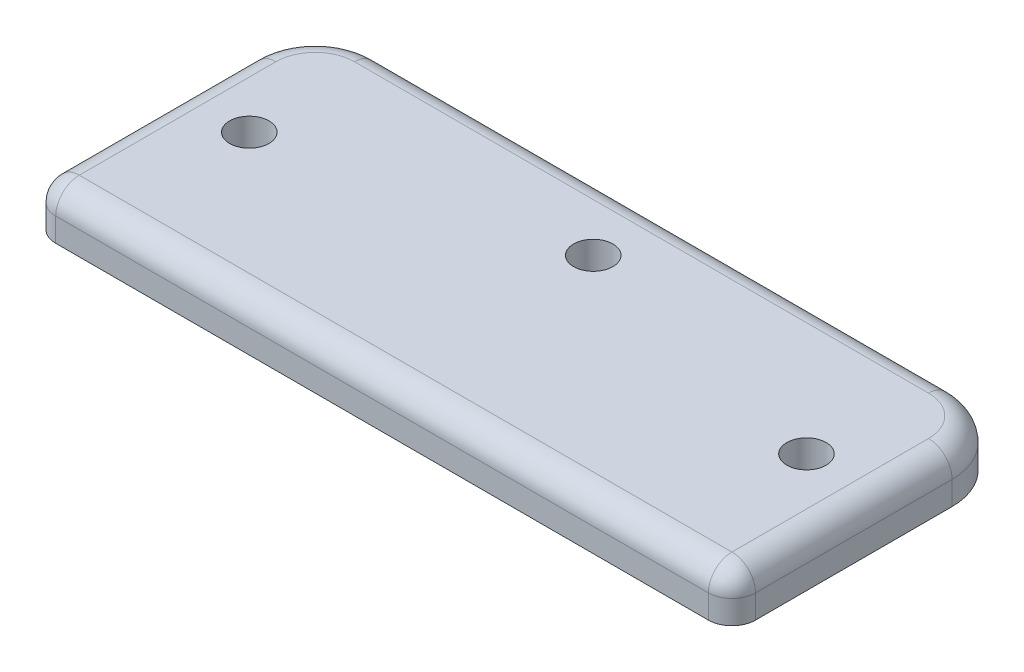
ISO-10303-21;
HEADER;
FILE_DESCRIPTION(('STEP AP214'),'2;1');
FILE_NAME('part.step','',(''),(''),'','','');
FILE_SCHEMA(('AUTOMOTIVE_DESIGN { 1 0 10303 214 1 1 1 1 }'));
ENDSEC;
DATA;
#1=APPLICATION_CONTEXT('core data for automotive mechanical design processes');
#2=APPLICATION_PROTOCOL_DEFINITION('international standard','automotive_design',2000,#1);
#3=PRODUCT_CONTEXT('',#1,'mechanical');
#4=PRODUCT('Part','Part','',(#3));
#5=PRODUCT_RELATED_PRODUCT_CATEGORY('part','',(#4));
#6=PRODUCT_DEFINITION_FORMATION('','',#4);
#7=PRODUCT_DEFINITION_CONTEXT('part definition',#1,'design');
#8=PRODUCT_DEFINITION('design','',#6,#7);
#9=PRODUCT_DEFINITION_SHAPE('','',#8);
#10=(LENGTH_UNIT() NAMED_UNIT(*) SI_UNIT(.MILLI.,.METRE.));
#11=(NAMED_UNIT(*) PLANE_ANGLE_UNIT() SI_UNIT($,.RADIAN.));
#12=(NAMED_UNIT(*) SI_UNIT($,.STERADIAN.) SOLID_ANGLE_UNIT());
#13=UNCERTAINTY_MEASURE_WITH_UNIT(LENGTH_MEASURE(1.E-05),#10,'distance_accuracy_value','');
#14=(GEOMETRIC_REPRESENTATION_CONTEXT(3) GLOBAL_UNCERTAINTY_ASSIGNED_CONTEXT((#13)) GLOBAL_UNIT_ASSIGNED_CONTEXT((#10,
#11,#12)) REPRESENTATION_CONTEXT('',''));
#15=CARTESIAN_POINT('',(0.,0.,0.));
#16=DIRECTION('',(0.,0.,1.));
#17=DIRECTION('',(1.,0.,0.));
#18=AXIS2_PLACEMENT_3D('',#15,#16,#17);
#19=CARTESIAN_POINT('',(36.5,6.,-10.));
#20=DIRECTION('',(0.,1.,0.));
#21=DIRECTION('',(0.,0.,1.));
#22=AXIS2_PLACEMENT_3D('',#19,#20,#21);
#23=PLANE('',#22);
#24=DIRECTION('',(0.,0.,-1.));
#25=VECTOR('',#24,1.);
#26=CARTESIAN_POINT('',(41.5,6.,-9.99999999999994));
#27=LINE('',#26,#25);
#28=CARTESIAN_POINT('',(41.5,6.,15.));
#29=VERTEX_POINT('',#28);
#30=CARTESIAN_POINT('',(41.5,6.,-9.99999999999996));
#31=VERTEX_POINT('',#30);
#32=EDGE_CURVE('E185',#29,#31,#27,.T.);
#33=ORIENTED_EDGE('',*,*,#32,.T.);
#34=CARTESIAN_POINT('',(36.5,6.,-10.));
#35=DIRECTION('',(0.,1.,0.));
#36=DIRECTION('',(0.,0.,1.));
#37=AXIS2_PLACEMENT_3D('',#34,#35,#36);
#38=CIRCLE('',#37,5.);
#39=CARTESIAN_POINT('',(36.5,6.,-15.));
#40=VERTEX_POINT('',#39);
#41=EDGE_CURVE('E187',#31,#40,#38,.T.);
#42=ORIENTED_EDGE('',*,*,#41,.T.);
#43=DIRECTION('',(-1.,0.,0.));
#44=VECTOR('',#43,1.);
#45=CARTESIAN_POINT('',(-36.5,6.,-15.));
#46=LINE('',#45,#44);
#47=CARTESIAN_POINT('',(-36.5,6.,-15.));
#48=VERTEX_POINT('',#47);
#49=EDGE_CURVE('E127',#40,#48,#46,.T.);
#50=ORIENTED_EDGE('',*,*,#49,.T.);
#51=CARTESIAN_POINT('',(-36.5,6.,-10.));
#52=DIRECTION('',(0.,1.,0.));
#53=DIRECTION('',(0.,0.,1.));
#54=AXIS2_PLACEMENT_3D('',#51,#52,#53);
#55=CIRCLE('',#54,5.);
#56=CARTESIAN_POINT('',(-41.5,6.,-9.99999999999994));
#57=VERTEX_POINT('',#56);
#58=EDGE_CURVE('E179',#48,#57,#55,.T.);
#59=ORIENTED_EDGE('',*,*,#58,.T.);
#60=DIRECTION('',(0.,0.,1.));
#61=VECTOR('',#60,1.);
#62=CARTESIAN_POINT('',(-41.5,6.,15.));
#63=LINE('',#62,#61);
#64=CARTESIAN_POINT('',(-41.5,6.,15.));
#65=VERTEX_POINT('',#64);
#66=EDGE_CURVE('E181',#57,#65,#63,.T.);
#67=ORIENTED_EDGE('',*,*,#66,.T.);
#68=DIRECTION('',(1.,0.,0.));
#69=VECTOR('',#68,1.);
#70=CARTESIAN_POINT('',(41.5,6.,15.));
#71=LINE('',#70,#69);
#72=EDGE_CURVE('E183',#65,#29,#71,.T.);
#73=ORIENTED_EDGE('',*,*,#72,.T.);
#74=EDGE_LOOP('',(#33,#42,#50,#59,#67,#73));
#75=FACE_BOUND('',#74,.T.);
#76=CARTESIAN_POINT('',(35.43,6.,-0.549999999999998));
#77=DIRECTION('',(0.,1.,0.));
#78=DIRECTION('',(0.,0.,1.));
#79=AXIS2_PLACEMENT_3D('',#76,#77,#78);
#80=CIRCLE('',#79,2.5);
#81=CARTESIAN_POINT('',(35.43,6.,1.95));
#82=VERTEX_POINT('',#81);
#83=EDGE_CURVE('E237',#82,#82,#80,.T.);
#84=ORIENTED_EDGE('',*,*,#83,.F.);
#85=EDGE_LOOP('',(#84));
#86=FACE_BOUND('',#85,.T.);
#87=CARTESIAN_POINT('',(0.,6.,-8.86));
#88=DIRECTION('',(0.,1.,0.));
#89=DIRECTION('',(0.,0.,1.));
#90=AXIS2_PLACEMENT_3D('',#87,#88,#89);
#91=CIRCLE('',#90,2.5);
#92=CARTESIAN_POINT('',(0.,6.,-6.36));
#93=VERTEX_POINT('',#92);
#94=EDGE_CURVE('E144',#93,#93,#91,.T.);
#95=ORIENTED_EDGE('',*,*,#94,.F.);
#96=EDGE_LOOP('',(#95));
#97=FACE_BOUND('',#96,.T.);
#98=CARTESIAN_POINT('',(-35.43,6.,-0.549999999999998));
#99=DIRECTION('',(0.,1.,0.));
#100=DIRECTION('',(0.,0.,-1.));
#101=AXIS2_PLACEMENT_3D('',#98,#99,#100);
#102=CIRCLE('',#101,2.5);
#103=CARTESIAN_POINT('',(-35.43,6.,-3.04999999999999));
#104=VERTEX_POINT('',#103);
#105=EDGE_CURVE('E229',#104,#104,#102,.T.);
#106=ORIENTED_EDGE('',*,*,#105,.F.);
#107=EDGE_LOOP('',(#106));
#108=FACE_BOUND('',#107,.T.);
#109=ADVANCED_FACE('F33',(#75,#86,#97,#108),#23,.T.);
#110=CARTESIAN_POINT('',(36.5,0.,-10.));
#111=DIRECTION('',(0.,1.,0.));
#112=DIRECTION('',(0.,0.,1.));
#113=AXIS2_PLACEMENT_3D('',#110,#111,#112);
#114=PLANE('',#113);
#115=CARTESIAN_POINT('',(36.5,0.,-10.));
#116=DIRECTION('',(0.,1.,0.));
#117=DIRECTION('',(0.,0.,1.));
#118=AXIS2_PLACEMENT_3D('',#115,#116,#117);
#119=CIRCLE('',#118,8.);
#120=CARTESIAN_POINT('',(44.5,0.,-9.99999999999994));
#121=VERTEX_POINT('',#120);
#122=CARTESIAN_POINT('',(36.4999999999999,0.,-18.));
#123=VERTEX_POINT('',#122);
#124=EDGE_CURVE('E135',#121,#123,#119,.T.);
#125=ORIENTED_EDGE('',*,*,#124,.F.);
#126=DIRECTION('',(0.,0.,-1.));
#127=VECTOR('',#126,1.);
#128=CARTESIAN_POINT('',(44.5,0.,-9.99999999999994));
#129=LINE('',#128,#127);
#130=CARTESIAN_POINT('',(44.5,0.,15.));
#131=VERTEX_POINT('',#130);
#132=EDGE_CURVE('E164',#131,#121,#129,.T.);
#133=ORIENTED_EDGE('',*,*,#132,.F.);
#134=CARTESIAN_POINT('',(41.5,0.,15.));
#135=DIRECTION('',(0.,1.,0.));
#136=DIRECTION('',(0.,0.,1.));
#137=AXIS2_PLACEMENT_3D('',#134,#135,#136);
#138=CIRCLE('',#137,3.);
#139=CARTESIAN_POINT('',(41.5,0.,18.));
#140=VERTEX_POINT('',#139);
#141=EDGE_CURVE('E161',#140,#131,#138,.T.);
#142=ORIENTED_EDGE('',*,*,#141,.F.);
#143=DIRECTION('',(1.,0.,0.));
#144=VECTOR('',#143,1.);
#145=CARTESIAN_POINT('',(-41.5,0.,18.));
#146=LINE('',#145,#144);
#147=CARTESIAN_POINT('',(-41.5,0.,18.));
#148=VERTEX_POINT('',#147);
#149=EDGE_CURVE('E158',#148,#140,#146,.T.);
#150=ORIENTED_EDGE('',*,*,#149,.F.);
#151=CARTESIAN_POINT('',(-41.5,0.,15.));
#152=DIRECTION('',(0.,1.,0.));
#153=DIRECTION('',(0.,0.,-1.));
#154=AXIS2_PLACEMENT_3D('',#151,#152,#153);
#155=CIRCLE('',#154,3.);
#156=CARTESIAN_POINT('',(-44.5,0.,15.));
#157=VERTEX_POINT('',#156);
#158=EDGE_CURVE('E155',#157,#148,#155,.T.);
#159=ORIENTED_EDGE('',*,*,#158,.F.);
#160=DIRECTION('',(0.,0.,1.));
#161=VECTOR('',#160,1.);
#162=CARTESIAN_POINT('',(-44.5,0.,-9.99999999999994));
#163=LINE('',#162,#161);
#164=CARTESIAN_POINT('',(-44.5,0.,-9.99999999999994));
#165=VERTEX_POINT('',#164);
#166=EDGE_CURVE('E152',#165,#157,#163,.T.);
#167=ORIENTED_EDGE('',*,*,#166,.F.);
#168=CARTESIAN_POINT('',(-36.5,0.,-10.));
#169=DIRECTION('',(0.,1.,0.));
#170=DIRECTION('',(0.,0.,1.));
#171=AXIS2_PLACEMENT_3D('',#168,#169,#170);
#172=CIRCLE('',#171,8.);
#173=CARTESIAN_POINT('',(-36.5,0.,-18.));
#174=VERTEX_POINT('',#173);
#175=EDGE_CURVE('E138',#174,#165,#172,.T.);
#176=ORIENTED_EDGE('',*,*,#175,.F.);
#177=DIRECTION('',(-1.,0.,0.));
#178=VECTOR('',#177,1.);
#179=CARTESIAN_POINT('',(-36.5,0.,-18.));
#180=LINE('',#179,#178);
#181=EDGE_CURVE('E120',#123,#174,#180,.T.);
#182=ORIENTED_EDGE('',*,*,#181,.F.);
#183=EDGE_LOOP('',(#125,#133,#142,#150,#159,#167,#176,#182));
#184=FACE_BOUND('',#183,.T.);
#185=CARTESIAN_POINT('',(0.,0.,-8.86));
#186=DIRECTION('',(0.,1.,0.));
#187=DIRECTION('',(0.,0.,1.));
#188=AXIS2_PLACEMENT_3D('',#185,#186,#187);
#189=CIRCLE('',#188,2.5);
#190=CARTESIAN_POINT('',(0.,0.,-6.36));
#191=VERTEX_POINT('',#190);
#192=EDGE_CURVE('E147',#191,#191,#189,.T.);
#193=ORIENTED_EDGE('',*,*,#192,.T.);
#194=EDGE_LOOP('',(#193));
#195=FACE_BOUND('',#194,.T.);
#196=CARTESIAN_POINT('',(35.43,0.,-0.549999999999998));
#197=DIRECTION('',(0.,1.,0.));
#198=DIRECTION('',(0.,0.,1.));
#199=AXIS2_PLACEMENT_3D('',#196,#197,#198);
#200=CIRCLE('',#199,2.5);
#201=CARTESIAN_POINT('',(35.43,0.,1.95));
#202=VERTEX_POINT('',#201);
#203=EDGE_CURVE('E234',#202,#202,#200,.T.);
#204=ORIENTED_EDGE('',*,*,#203,.T.);
#205=EDGE_LOOP('',(#204));
#206=FACE_BOUND('',#205,.T.);
#207=CARTESIAN_POINT('',(-35.43,0.,-0.549999999999998));
#208=DIRECTION('',(0.,1.,0.));
#209=DIRECTION('',(0.,0.,-1.));
#210=AXIS2_PLACEMENT_3D('',#207,#208,#209);
#211=CIRCLE('',#210,2.5);
#212=CARTESIAN_POINT('',(-35.43,0.,-3.04999999999999));
#213=VERTEX_POINT('',#212);
#214=EDGE_CURVE('E224',#213,#213,#211,.T.);
#215=ORIENTED_EDGE('',*,*,#214,.T.);
#216=EDGE_LOOP('',(#215));
#217=FACE_BOUND('',#216,.T.);
#218=ADVANCED_FACE('F132',(#184,#195,#206,#217),#114,.F.);
#219=CARTESIAN_POINT('',(36.5,6.,-10.));
#220=DIRECTION('',(0.,-1.,0.));
#221=DIRECTION('',(0.,0.,-1.));
#222=AXIS2_PLACEMENT_3D('',#219,#220,#221);
#223=CYLINDRICAL_SURFACE('',#222,8.);
#224=DIRECTION('',(0.,-1.,0.));
#225=VECTOR('',#224,1.);
#226=CARTESIAN_POINT('',(36.4999999999999,6.,-18.));
#227=LINE('',#226,#225);
#228=CARTESIAN_POINT('',(36.4999999999999,3.,-18.));
#229=VERTEX_POINT('',#228);
#230=EDGE_CURVE('E117',#229,#123,#227,.T.);
#231=ORIENTED_EDGE('',*,*,#230,.F.);
#232=CARTESIAN_POINT('',(36.5,3.,-10.));
#233=DIRECTION('',(0.,1.,0.));
#234=DIRECTION('',(0.,0.,1.));
#235=AXIS2_PLACEMENT_3D('',#232,#233,#234);
#236=CIRCLE('',#235,8.);
#237=CARTESIAN_POINT('',(44.5,3.,-9.99999999999994));
#238=VERTEX_POINT('',#237);
#239=EDGE_CURVE('E190',#229,#238,#236,.F.);
#240=ORIENTED_EDGE('',*,*,#239,.T.);
#241=DIRECTION('',(0.,-1.,0.));
#242=VECTOR('',#241,1.);
#243=CARTESIAN_POINT('',(44.5,6.,-9.99999999999994));
#244=LINE('',#243,#242);
#245=EDGE_CURVE('E142',#238,#121,#244,.T.);
#246=ORIENTED_EDGE('',*,*,#245,.T.);
#247=ORIENTED_EDGE('',*,*,#124,.T.);
#248=EDGE_LOOP('',(#231,#240,#246,#247));
#249=FACE_BOUND('',#248,.T.);
#250=ADVANCED_FACE('F140',(#249),#223,.T.);
#251=CARTESIAN_POINT('',(-36.5,6.,-18.));
#252=DIRECTION('',(0.,0.,1.));
#253=DIRECTION('',(1.,0.,0.));
#254=AXIS2_PLACEMENT_3D('',#251,#252,#253);
#255=PLANE('',#254);
#256=DIRECTION('',(0.,-1.,0.));
#257=VECTOR('',#256,1.);
#258=CARTESIAN_POINT('',(-36.5,6.,-18.));
#259=LINE('',#258,#257);
#260=CARTESIAN_POINT('',(-36.5,3.,-18.));
#261=VERTEX_POINT('',#260);
#262=EDGE_CURVE('E128',#261,#174,#259,.T.);
#263=ORIENTED_EDGE('',*,*,#262,.F.);
#264=DIRECTION('',(-1.,0.,0.));
#265=VECTOR('',#264,1.);
#266=CARTESIAN_POINT('',(36.4999999999999,3.,-18.));
#267=LINE('',#266,#265);
#268=EDGE_CURVE('E11',#261,#229,#267,.F.);
#269=ORIENTED_EDGE('',*,*,#268,.T.);
#270=ORIENTED_EDGE('',*,*,#230,.T.);
#271=ORIENTED_EDGE('',*,*,#181,.T.);
#272=EDGE_LOOP('',(#263,#269,#270,#271));
#273=FACE_BOUND('',#272,.T.);
#274=ADVANCED_FACE('F119',(#273),#255,.F.);
#275=CARTESIAN_POINT('',(-36.5,6.,-10.));
#276=DIRECTION('',(0.,-1.,0.));
#277=DIRECTION('',(0.,0.,-1.));
#278=AXIS2_PLACEMENT_3D('',#275,#276,#277);
#279=CYLINDRICAL_SURFACE('',#278,8.);
#280=DIRECTION('',(0.,-1.,0.));
#281=VECTOR('',#280,1.);
#282=CARTESIAN_POINT('',(-44.5,6.,-9.99999999999994));
#283=LINE('',#282,#281);
#284=CARTESIAN_POINT('',(-44.5,3.,-9.99999999999994));
#285=VERTEX_POINT('',#284);
#286=EDGE_CURVE('E175',#285,#165,#283,.T.);
#287=ORIENTED_EDGE('',*,*,#286,.F.);
#288=CARTESIAN_POINT('',(-36.5,3.,-10.));
#289=DIRECTION('',(0.,1.,0.));
#290=DIRECTION('',(0.,0.,1.));
#291=AXIS2_PLACEMENT_3D('',#288,#289,#290);
#292=CIRCLE('',#291,8.);
#293=EDGE_CURVE('E42',#285,#261,#292,.F.);
#294=ORIENTED_EDGE('',*,*,#293,.T.);
#295=ORIENTED_EDGE('',*,*,#262,.T.);
#296=ORIENTED_EDGE('',*,*,#175,.T.);
#297=EDGE_LOOP('',(#287,#294,#295,#296));
#298=FACE_BOUND('',#297,.T.);
#299=ADVANCED_FACE('F286',(#298),#279,.T.);
#300=CARTESIAN_POINT('',(-44.5,6.,-9.99999999999994));
#301=DIRECTION('',(1.,0.,0.));
#302=DIRECTION('',(0.,0.,-1.));
#303=AXIS2_PLACEMENT_3D('',#300,#301,#302);
#304=PLANE('',#303);
#305=DIRECTION('',(0.,-1.,0.));
#306=VECTOR('',#305,1.);
#307=CARTESIAN_POINT('',(-44.5,6.,15.));
#308=LINE('',#307,#306);
#309=CARTESIAN_POINT('',(-44.5,3.,15.));
#310=VERTEX_POINT('',#309);
#311=EDGE_CURVE('E173',#310,#157,#308,.T.);
#312=ORIENTED_EDGE('',*,*,#311,.F.);
#313=DIRECTION('',(0.,0.,1.));
#314=VECTOR('',#313,1.);
#315=CARTESIAN_POINT('',(-44.5,3.,-9.99999999999994));
#316=LINE('',#315,#314);
#317=EDGE_CURVE('E57',#310,#285,#316,.F.);
#318=ORIENTED_EDGE('',*,*,#317,.T.);
#319=ORIENTED_EDGE('',*,*,#286,.T.);
#320=ORIENTED_EDGE('',*,*,#166,.T.);
#321=EDGE_LOOP('',(#312,#318,#319,#320));
#322=FACE_BOUND('',#321,.T.);
#323=ADVANCED_FACE('F282',(#322),#304,.F.);
#324=CARTESIAN_POINT('',(-41.5,6.,15.));
#325=DIRECTION('',(0.,-1.,0.));
#326=DIRECTION('',(0.,0.,-1.));
#327=AXIS2_PLACEMENT_3D('',#324,#325,#326);
#328=CYLINDRICAL_SURFACE('',#327,3.);
#329=DIRECTION('',(0.,-1.,0.));
#330=VECTOR('',#329,1.);
#331=CARTESIAN_POINT('',(-41.5,6.,18.));
#332=LINE('',#331,#330);
#333=CARTESIAN_POINT('',(-41.5,3.,18.));
#334=VERTEX_POINT('',#333);
#335=EDGE_CURVE('E171',#334,#148,#332,.T.);
#336=ORIENTED_EDGE('',*,*,#335,.F.);
#337=CARTESIAN_POINT('',(-41.5,3.,15.));
#338=DIRECTION('',(0.,-1.,0.));
#339=DIRECTION('',(0.,0.,-1.));
#340=AXIS2_PLACEMENT_3D('',#337,#338,#339);
#341=CIRCLE('',#340,3.);
#342=EDGE_CURVE('E198',#334,#310,#341,.T.);
#343=ORIENTED_EDGE('',*,*,#342,.T.);
#344=ORIENTED_EDGE('',*,*,#311,.T.);
#345=ORIENTED_EDGE('',*,*,#158,.T.);
#346=EDGE_LOOP('',(#336,#343,#344,#345));
#347=FACE_BOUND('',#346,.T.);
#348=ADVANCED_FACE('F278',(#347),#328,.T.);
#349=CARTESIAN_POINT('',(-41.5,6.,18.));
#350=DIRECTION('',(0.,0.,-1.));
#351=DIRECTION('',(-1.,0.,0.));
#352=AXIS2_PLACEMENT_3D('',#349,#350,#351);
#353=PLANE('',#352);
#354=DIRECTION('',(0.,-1.,0.));
#355=VECTOR('',#354,1.);
#356=CARTESIAN_POINT('',(41.5,6.,18.));
#357=LINE('',#356,#355);
#358=CARTESIAN_POINT('',(41.5,3.,18.));
#359=VERTEX_POINT('',#358);
#360=EDGE_CURVE('E169',#359,#140,#357,.T.);
#361=ORIENTED_EDGE('',*,*,#360,.F.);
#362=DIRECTION('',(1.,0.,0.));
#363=VECTOR('',#362,1.);
#364=CARTESIAN_POINT('',(-41.5,3.,18.));
#365=LINE('',#364,#363);
#366=EDGE_CURVE('E196',#359,#334,#365,.F.);
#367=ORIENTED_EDGE('',*,*,#366,.T.);
#368=ORIENTED_EDGE('',*,*,#335,.T.);
#369=ORIENTED_EDGE('',*,*,#149,.T.);
#370=EDGE_LOOP('',(#361,#367,#368,#369));
#371=FACE_BOUND('',#370,.T.);
#372=ADVANCED_FACE('F274',(#371),#353,.F.);
#373=CARTESIAN_POINT('',(41.5,6.,15.));
#374=DIRECTION('',(0.,-1.,0.));
#375=DIRECTION('',(0.,0.,-1.));
#376=AXIS2_PLACEMENT_3D('',#373,#374,#375);
#377=CYLINDRICAL_SURFACE('',#376,3.);
#378=DIRECTION('',(0.,-1.,0.));
#379=VECTOR('',#378,1.);
#380=CARTESIAN_POINT('',(44.5,6.,15.));
#381=LINE('',#380,#379);
#382=CARTESIAN_POINT('',(44.5,3.,15.));
#383=VERTEX_POINT('',#382);
#384=EDGE_CURVE('E167',#383,#131,#381,.T.);
#385=ORIENTED_EDGE('',*,*,#384,.F.);
#386=CARTESIAN_POINT('',(41.5,3.,15.));
#387=DIRECTION('',(0.,-1.,0.));
#388=DIRECTION('',(0.,0.,-1.));
#389=AXIS2_PLACEMENT_3D('',#386,#387,#388);
#390=CIRCLE('',#389,3.);
#391=EDGE_CURVE('E194',#383,#359,#390,.T.);
#392=ORIENTED_EDGE('',*,*,#391,.T.);
#393=ORIENTED_EDGE('',*,*,#360,.T.);
#394=ORIENTED_EDGE('',*,*,#141,.T.);
#395=EDGE_LOOP('',(#385,#392,#393,#394));
#396=FACE_BOUND('',#395,.T.);
#397=ADVANCED_FACE('F270',(#396),#377,.T.);
#398=CARTESIAN_POINT('',(44.5,6.,-9.99999999999994));
#399=DIRECTION('',(-1.,0.,0.));
#400=DIRECTION('',(0.,0.,1.));
#401=AXIS2_PLACEMENT_3D('',#398,#399,#400);
#402=PLANE('',#401);
#403=ORIENTED_EDGE('',*,*,#245,.F.);
#404=DIRECTION('',(0.,0.,-1.));
#405=VECTOR('',#404,1.);
#406=CARTESIAN_POINT('',(44.5,3.,15.));
#407=LINE('',#406,#405);
#408=EDGE_CURVE('E192',#238,#383,#407,.F.);
#409=ORIENTED_EDGE('',*,*,#408,.T.);
#410=ORIENTED_EDGE('',*,*,#384,.T.);
#411=ORIENTED_EDGE('',*,*,#132,.T.);
#412=EDGE_LOOP('',(#403,#409,#410,#411));
#413=FACE_BOUND('',#412,.T.);
#414=ADVANCED_FACE('F256',(#413),#402,.F.);
#415=CARTESIAN_POINT('',(0.,6.,-8.86));
#416=DIRECTION('',(0.,-1.,0.));
#417=DIRECTION('',(0.,0.,-1.));
#418=AXIS2_PLACEMENT_3D('',#415,#416,#417);
#419=CYLINDRICAL_SURFACE('',#418,2.5);
#420=ORIENTED_EDGE('',*,*,#94,.T.);
#421=EDGE_LOOP('',(#420));
#422=FACE_BOUND('',#421,.T.);
#423=ORIENTED_EDGE('',*,*,#192,.F.);
#424=EDGE_LOOP('',(#423));
#425=FACE_BOUND('',#424,.T.);
#426=ADVANCED_FACE('F247',(#422,#425),#419,.F.);
#427=CARTESIAN_POINT('',(35.43,6.,-0.549999999999998));
#428=DIRECTION('',(0.,-1.,0.));
#429=DIRECTION('',(0.,0.,-1.));
#430=AXIS2_PLACEMENT_3D('',#427,#428,#429);
#431=CYLINDRICAL_SURFACE('',#430,2.5);
#432=ORIENTED_EDGE('',*,*,#83,.T.);
#433=EDGE_LOOP('',(#432));
#434=FACE_BOUND('',#433,.T.);
#435=ORIENTED_EDGE('',*,*,#203,.F.);
#436=EDGE_LOOP('',(#435));
#437=FACE_BOUND('',#436,.T.);
#438=ADVANCED_FACE('F244',(#434,#437),#431,.F.);
#439=CARTESIAN_POINT('',(-35.43,6.,-0.549999999999998));
#440=DIRECTION('',(0.,-1.,0.));
#441=DIRECTION('',(0.,0.,-1.));
#442=AXIS2_PLACEMENT_3D('',#439,#440,#441);
#443=CYLINDRICAL_SURFACE('',#442,2.5);
#444=ORIENTED_EDGE('',*,*,#105,.T.);
#445=EDGE_LOOP('',(#444));
#446=FACE_BOUND('',#445,.T.);
#447=ORIENTED_EDGE('',*,*,#214,.F.);
#448=EDGE_LOOP('',(#447));
#449=FACE_BOUND('',#448,.T.);
#450=ADVANCED_FACE('F246',(#446,#449),#443,.F.);
#451=CARTESIAN_POINT('',(-41.5,3.,15.));
#452=DIRECTION('',(0.,1.,0.));
#453=DIRECTION('',(0.,0.,1.));
#454=AXIS2_PLACEMENT_3D('',#451,#452,#453);
#455=SPHERICAL_SURFACE('',#454,3.);
#456=CARTESIAN_POINT('',(-41.5,3.,15.));
#457=DIRECTION('',(0.,0.,-1.));
#458=DIRECTION('',(-1.,0.,0.));
#459=AXIS2_PLACEMENT_3D('',#456,#457,#458);
#460=CIRCLE('',#459,3.);
#461=EDGE_CURVE('E217',#310,#65,#460,.T.);
#462=ORIENTED_EDGE('',*,*,#461,.F.);
#463=ORIENTED_EDGE('',*,*,#342,.F.);
#464=CARTESIAN_POINT('',(-41.5,3.,15.));
#465=DIRECTION('',(1.,0.,0.));
#466=DIRECTION('',(0.,0.,-1.));
#467=AXIS2_PLACEMENT_3D('',#464,#465,#466);
#468=CIRCLE('',#467,3.);
#469=EDGE_CURVE('E37',#65,#334,#468,.T.);
#470=ORIENTED_EDGE('',*,*,#469,.F.);
#471=EDGE_LOOP('',(#462,#463,#470));
#472=FACE_BOUND('',#471,.T.);
#473=ADVANCED_FACE('F35',(#472),#455,.T.);
#474=CARTESIAN_POINT('',(36.5,3.,15.));
#475=DIRECTION('',(-1.,0.,0.));
#476=DIRECTION('',(0.,0.,1.));
#477=AXIS2_PLACEMENT_3D('',#474,#475,#476);
#478=CYLINDRICAL_SURFACE('',#477,3.);
#479=ORIENTED_EDGE('',*,*,#469,.T.);
#480=ORIENTED_EDGE('',*,*,#366,.F.);
#481=CARTESIAN_POINT('',(41.5,3.,15.));
#482=DIRECTION('',(1.,0.,0.));
#483=DIRECTION('',(0.,0.,-1.));
#484=AXIS2_PLACEMENT_3D('',#481,#482,#483);
#485=CIRCLE('',#484,3.);
#486=EDGE_CURVE('E215',#29,#359,#485,.T.);
#487=ORIENTED_EDGE('',*,*,#486,.F.);
#488=ORIENTED_EDGE('',*,*,#72,.F.);
#489=EDGE_LOOP('',(#479,#480,#487,#488));
#490=FACE_BOUND('',#489,.T.);
#491=ADVANCED_FACE('F315',(#490),#478,.T.);
#492=CARTESIAN_POINT('',(-41.5,3.,-9.99999999999998));
#493=DIRECTION('',(0.,0.,-1.));
#494=DIRECTION('',(-1.,0.,0.));
#495=AXIS2_PLACEMENT_3D('',#492,#493,#494);
#496=CYLINDRICAL_SURFACE('',#495,3.);
#497=ORIENTED_EDGE('',*,*,#461,.T.);
#498=ORIENTED_EDGE('',*,*,#66,.F.);
#499=CARTESIAN_POINT('',(-41.5,3.,-9.99999999999994));
#500=DIRECTION('',(0.,0.,-1.));
#501=DIRECTION('',(-1.,0.,0.));
#502=AXIS2_PLACEMENT_3D('',#499,#500,#501);
#503=CIRCLE('',#502,3.);
#504=EDGE_CURVE('E212',#285,#57,#503,.T.);
#505=ORIENTED_EDGE('',*,*,#504,.F.);
#506=ORIENTED_EDGE('',*,*,#317,.F.);
#507=EDGE_LOOP('',(#497,#498,#505,#506));
#508=FACE_BOUND('',#507,.T.);
#509=ADVANCED_FACE('F312',(#508),#496,.T.);
#510=CARTESIAN_POINT('',(41.5,3.,15.));
#511=DIRECTION('',(0.,1.,0.));
#512=DIRECTION('',(0.,0.,1.));
#513=AXIS2_PLACEMENT_3D('',#510,#511,#512);
#514=SPHERICAL_SURFACE('',#513,3.);
#515=ORIENTED_EDGE('',*,*,#486,.T.);
#516=ORIENTED_EDGE('',*,*,#391,.F.);
#517=CARTESIAN_POINT('',(41.5,3.,15.));
#518=DIRECTION('',(0.,0.,-1.));
#519=DIRECTION('',(-1.,0.,0.));
#520=AXIS2_PLACEMENT_3D('',#517,#518,#519);
#521=CIRCLE('',#520,3.);
#522=EDGE_CURVE('E209',#29,#383,#521,.T.);
#523=ORIENTED_EDGE('',*,*,#522,.F.);
#524=EDGE_LOOP('',(#515,#516,#523));
#525=FACE_BOUND('',#524,.T.);
#526=ADVANCED_FACE('F308',(#525),#514,.T.);
#527=CARTESIAN_POINT('',(-36.5,3.,-10.));
#528=DIRECTION('',(0.,1.,0.));
#529=DIRECTION('',(0.,0.,1.));
#530=AXIS2_PLACEMENT_3D('',#527,#528,#529);
#531=TOROIDAL_SURFACE('',#530,5.,3.);
#532=ORIENTED_EDGE('',*,*,#504,.T.);
#533=ORIENTED_EDGE('',*,*,#58,.F.);
#534=CARTESIAN_POINT('',(-36.5,3.,-15.));
#535=DIRECTION('',(1.,0.,0.));
#536=DIRECTION('',(0.,0.,-1.));
#537=AXIS2_PLACEMENT_3D('',#534,#535,#536);
#538=CIRCLE('',#537,3.);
#539=EDGE_CURVE('E206',#261,#48,#538,.T.);
#540=ORIENTED_EDGE('',*,*,#539,.F.);
#541=ORIENTED_EDGE('',*,*,#293,.F.);
#542=EDGE_LOOP('',(#532,#533,#540,#541));
#543=FACE_BOUND('',#542,.T.);
#544=ADVANCED_FACE('F304',(#543),#531,.T.);
#545=CARTESIAN_POINT('',(41.5,3.,-10.));
#546=DIRECTION('',(0.,0.,1.));
#547=DIRECTION('',(1.,0.,0.));
#548=AXIS2_PLACEMENT_3D('',#545,#546,#547);
#549=CYLINDRICAL_SURFACE('',#548,3.);
#550=ORIENTED_EDGE('',*,*,#522,.T.);
#551=ORIENTED_EDGE('',*,*,#408,.F.);
#552=CARTESIAN_POINT('',(41.5,3.,-9.99999999999996));
#553=DIRECTION('',(0.,0.,-1.));
#554=DIRECTION('',(-1.,0.,0.));
#555=AXIS2_PLACEMENT_3D('',#552,#553,#554);
#556=CIRCLE('',#555,3.);
#557=EDGE_CURVE('E204',#31,#238,#556,.T.);
#558=ORIENTED_EDGE('',*,*,#557,.F.);
#559=ORIENTED_EDGE('',*,*,#32,.F.);
#560=EDGE_LOOP('',(#550,#551,#558,#559));
#561=FACE_BOUND('',#560,.T.);
#562=ADVANCED_FACE('F300',(#561),#549,.T.);
#563=CARTESIAN_POINT('',(36.5,3.,-15.));
#564=DIRECTION('',(1.,0.,0.));
#565=DIRECTION('',(0.,0.,-1.));
#566=AXIS2_PLACEMENT_3D('',#563,#564,#565);
#567=CYLINDRICAL_SURFACE('',#566,3.);
#568=ORIENTED_EDGE('',*,*,#539,.T.);
#569=ORIENTED_EDGE('',*,*,#49,.F.);
#570=CARTESIAN_POINT('',(36.4999999999999,3.,-15.));
#571=DIRECTION('',(1.,0.,0.));
#572=DIRECTION('',(0.,1.,0.));
#573=AXIS2_PLACEMENT_3D('',#570,#571,#572);
#574=CIRCLE('',#573,3.);
#575=EDGE_CURVE('E202',#229,#40,#574,.T.);
#576=ORIENTED_EDGE('',*,*,#575,.F.);
#577=ORIENTED_EDGE('',*,*,#268,.F.);
#578=EDGE_LOOP('',(#568,#569,#576,#577));
#579=FACE_BOUND('',#578,.T.);
#580=ADVANCED_FACE('F296',(#579),#567,.T.);
#581=CARTESIAN_POINT('',(36.5,3.,-10.));
#582=DIRECTION('',(0.,1.,0.));
#583=DIRECTION('',(0.,0.,1.));
#584=AXIS2_PLACEMENT_3D('',#581,#582,#583);
#585=TOROIDAL_SURFACE('',#584,5.,3.);
#586=ORIENTED_EDGE('',*,*,#557,.T.);
#587=ORIENTED_EDGE('',*,*,#239,.F.);
#588=ORIENTED_EDGE('',*,*,#575,.T.);
#589=ORIENTED_EDGE('',*,*,#41,.F.);
#590=EDGE_LOOP('',(#586,#587,#588,#589));
#591=FACE_BOUND('',#590,.T.);
#592=ADVANCED_FACE('F293',(#591),#585,.T.);
#593=CLOSED_SHELL('',(#109,#218,#250,#274,#299,#323,#348,#372,#397,#414,#426,#438,#450,#473,
#491,#509,#526,#544,#562,#580,#592));
#594=MANIFOLD_SOLID_BREP('B2',#593);
#595=ADVANCED_BREP_SHAPE_REPRESENTATION('',(#18,#594),#14);
#596=SHAPE_DEFINITION_REPRESENTATION(#9,#595);
ENDSEC;
END-ISO-10303-21;
